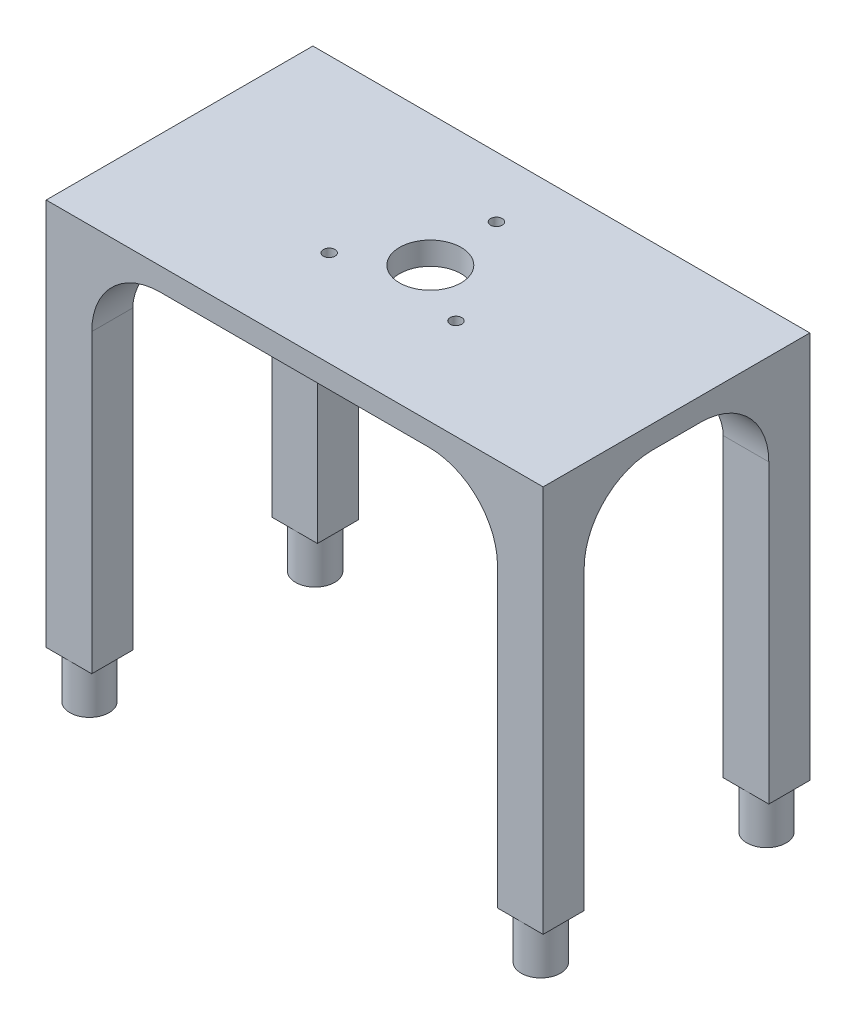
ISO-10303-21;
HEADER;
FILE_DESCRIPTION(('STEP AP214'),'2;1');
FILE_NAME('part.step','',(''),(''),'','','');
FILE_SCHEMA(('AUTOMOTIVE_DESIGN { 1 0 10303 214 1 1 1 1 }'));
ENDSEC;
DATA;
#1=APPLICATION_CONTEXT('core data for automotive mechanical design processes');
#2=APPLICATION_PROTOCOL_DEFINITION('international standard','automotive_design',2000,#1);
#3=PRODUCT_CONTEXT('',#1,'mechanical');
#4=PRODUCT('Part','Part','',(#3));
#5=PRODUCT_RELATED_PRODUCT_CATEGORY('part','',(#4));
#6=PRODUCT_DEFINITION_FORMATION('','',#4);
#7=PRODUCT_DEFINITION_CONTEXT('part definition',#1,'design');
#8=PRODUCT_DEFINITION('design','',#6,#7);
#9=PRODUCT_DEFINITION_SHAPE('','',#8);
#10=(LENGTH_UNIT() NAMED_UNIT(*) SI_UNIT(.MILLI.,.METRE.));
#11=(NAMED_UNIT(*) PLANE_ANGLE_UNIT() SI_UNIT($,.RADIAN.));
#12=(NAMED_UNIT(*) SI_UNIT($,.STERADIAN.) SOLID_ANGLE_UNIT());
#13=UNCERTAINTY_MEASURE_WITH_UNIT(LENGTH_MEASURE(1.E-05),#10,'distance_accuracy_value','');
#14=(GEOMETRIC_REPRESENTATION_CONTEXT(3) GLOBAL_UNCERTAINTY_ASSIGNED_CONTEXT((#13)) GLOBAL_UNIT_ASSIGNED_CONTEXT((#10,
#11,#12)) REPRESENTATION_CONTEXT('',''));
#15=CARTESIAN_POINT('',(0.,0.,0.));
#16=DIRECTION('',(0.,0.,1.));
#17=DIRECTION('',(1.,0.,0.));
#18=AXIS2_PLACEMENT_3D('',#15,#16,#17);
#19=CARTESIAN_POINT('',(0.,90.,0.));
#20=DIRECTION('',(0.,-1.,0.));
#21=DIRECTION('',(0.,0.,-1.));
#22=AXIS2_PLACEMENT_3D('',#19,#20,#21);
#23=PLANE('',#22);
#24=CARTESIAN_POINT('',(-0.965131435348161,90.,-40.7219628095155));
#25=DIRECTION('',(0.,1.,0.));
#26=DIRECTION('',(0.,0.,1.));
#27=AXIS2_PLACEMENT_3D('',#24,#25,#26);
#28=CIRCLE('',#27,1.275);
#29=CARTESIAN_POINT('',(-0.965131435348161,90.,-39.4469628095155));
#30=VERTEX_POINT('',#29);
#31=EDGE_CURVE('E461',#30,#30,#28,.T.);
#32=ORIENTED_EDGE('',*,*,#31,.T.);
#33=EDGE_LOOP('',(#32));
#34=FACE_BOUND('',#33,.T.);
#35=CARTESIAN_POINT('',(0.00302612595053098,90.,-25.2522287802408));
#36=DIRECTION('',(0.,1.,0.));
#37=DIRECTION('',(0.,0.,1.));
#38=AXIS2_PLACEMENT_3D('',#35,#36,#37);
#39=CIRCLE('',#38,6.75);
#40=CARTESIAN_POINT('',(0.00302612595053098,90.,-18.5022287802408));
#41=VERTEX_POINT('',#40);
#42=EDGE_CURVE('E482',#41,#41,#39,.T.);
#43=ORIENTED_EDGE('',*,*,#42,.T.);
#44=EDGE_LOOP('',(#43));
#45=FACE_BOUND('',#44,.T.);
#46=CARTESIAN_POINT('',(-13.4203676327494,90.,-16.5022287802408));
#47=DIRECTION('',(0.,1.,0.));
#48=DIRECTION('',(0.,0.,1.));
#49=AXIS2_PLACEMENT_3D('',#46,#47,#48);
#50=CIRCLE('',#49,1.275);
#51=CARTESIAN_POINT('',(-13.4203676327494,90.,-15.2272287802408));
#52=VERTEX_POINT('',#51);
#53=EDGE_CURVE('E481',#52,#52,#50,.T.);
#54=ORIENTED_EDGE('',*,*,#53,.T.);
#55=EDGE_LOOP('',(#54));
#56=FACE_BOUND('',#55,.T.);
#57=CARTESIAN_POINT('',(13.4089002647704,90.,-17.4719628095155));
#58=DIRECTION('',(0.,1.,0.));
#59=DIRECTION('',(0.,0.,1.));
#60=AXIS2_PLACEMENT_3D('',#57,#58,#59);
#61=CIRCLE('',#60,1.275);
#62=CARTESIAN_POINT('',(13.4089002647704,90.,-16.1969628095156));
#63=VERTEX_POINT('',#62);
#64=EDGE_CURVE('E489',#63,#63,#61,.T.);
#65=ORIENTED_EDGE('',*,*,#64,.T.);
#66=EDGE_LOOP('',(#65));
#67=FACE_BOUND('',#66,.T.);
#68=DIRECTION('',(1.,0.,0.));
#69=VECTOR('',#68,1.);
#70=CARTESIAN_POINT('',(0.,90.,-30.));
#71=LINE('',#70,#69);
#72=CARTESIAN_POINT('',(-54.5,90.,-30.));
#73=VERTEX_POINT('',#72);
#74=CARTESIAN_POINT('',(-29.5,90.,-30.));
#75=VERTEX_POINT('',#74);
#76=EDGE_CURVE('E397',#73,#75,#71,.T.);
#77=ORIENTED_EDGE('',*,*,#76,.T.);
#78=DIRECTION('',(0.,0.,-1.));
#79=VECTOR('',#78,1.);
#80=CARTESIAN_POINT('',(-29.5,90.,0.));
#81=LINE('',#80,#79);
#82=CARTESIAN_POINT('',(-29.5,90.,-54.));
#83=VERTEX_POINT('',#82);
#84=EDGE_CURVE('E400',#75,#83,#81,.T.);
#85=ORIENTED_EDGE('',*,*,#84,.T.);
#86=DIRECTION('',(-1.,0.,0.));
#87=VECTOR('',#86,1.);
#88=CARTESIAN_POINT('',(-54.5,90.,-54.));
#89=LINE('',#88,#87);
#90=CARTESIAN_POINT('',(29.5,90.,-54.));
#91=VERTEX_POINT('',#90);
#92=EDGE_CURVE('E308',#91,#83,#89,.T.);
#93=ORIENTED_EDGE('',*,*,#92,.F.);
#94=DIRECTION('',(0.,0.,1.));
#95=VECTOR('',#94,1.);
#96=CARTESIAN_POINT('',(29.5,90.,0.));
#97=LINE('',#96,#95);
#98=CARTESIAN_POINT('',(29.5,90.,-30.));
#99=VERTEX_POINT('',#98);
#100=EDGE_CURVE('E386',#91,#99,#97,.T.);
#101=ORIENTED_EDGE('',*,*,#100,.T.);
#102=DIRECTION('',(1.,0.,0.));
#103=VECTOR('',#102,1.);
#104=CARTESIAN_POINT('',(0.,90.,-30.));
#105=LINE('',#104,#103);
#106=CARTESIAN_POINT('',(54.5,90.,-30.));
#107=VERTEX_POINT('',#106);
#108=EDGE_CURVE('E383',#99,#107,#105,.T.);
#109=ORIENTED_EDGE('',*,*,#108,.T.);
#110=DIRECTION('',(0.,0.,-1.));
#111=VECTOR('',#110,1.);
#112=CARTESIAN_POINT('',(54.5,90.,4.5));
#113=LINE('',#112,#111);
#114=CARTESIAN_POINT('',(54.5,90.,-19.5));
#115=VERTEX_POINT('',#114);
#116=EDGE_CURVE('E325',#115,#107,#113,.T.);
#117=ORIENTED_EDGE('',*,*,#116,.F.);
#118=DIRECTION('',(-1.,0.,0.));
#119=VECTOR('',#118,1.);
#120=CARTESIAN_POINT('',(0.,90.,-19.5));
#121=LINE('',#120,#119);
#122=CARTESIAN_POINT('',(29.5,90.,-19.5));
#123=VERTEX_POINT('',#122);
#124=EDGE_CURVE('E379',#115,#123,#121,.T.);
#125=ORIENTED_EDGE('',*,*,#124,.T.);
#126=DIRECTION('',(0.,0.,1.));
#127=VECTOR('',#126,1.);
#128=CARTESIAN_POINT('',(29.5,90.,0.));
#129=LINE('',#128,#127);
#130=CARTESIAN_POINT('',(29.5,90.,4.5));
#131=VERTEX_POINT('',#130);
#132=EDGE_CURVE('E373',#123,#131,#129,.T.);
#133=ORIENTED_EDGE('',*,*,#132,.T.);
#134=DIRECTION('',(1.,0.,0.));
#135=VECTOR('',#134,1.);
#136=CARTESIAN_POINT('',(-54.5,90.,4.5));
#137=LINE('',#136,#135);
#138=CARTESIAN_POINT('',(-29.5,90.,4.5));
#139=VERTEX_POINT('',#138);
#140=EDGE_CURVE('E322',#139,#131,#137,.T.);
#141=ORIENTED_EDGE('',*,*,#140,.F.);
#142=DIRECTION('',(0.,0.,-1.));
#143=VECTOR('',#142,1.);
#144=CARTESIAN_POINT('',(-29.5,90.,0.));
#145=LINE('',#144,#143);
#146=CARTESIAN_POINT('',(-29.5,90.,-19.5));
#147=VERTEX_POINT('',#146);
#148=EDGE_CURVE('E393',#139,#147,#145,.T.);
#149=ORIENTED_EDGE('',*,*,#148,.T.);
#150=DIRECTION('',(-1.,0.,0.));
#151=VECTOR('',#150,1.);
#152=CARTESIAN_POINT('',(0.,90.,-19.5));
#153=LINE('',#152,#151);
#154=CARTESIAN_POINT('',(-54.5,90.,-19.5));
#155=VERTEX_POINT('',#154);
#156=EDGE_CURVE('E390',#147,#155,#153,.T.);
#157=ORIENTED_EDGE('',*,*,#156,.T.);
#158=DIRECTION('',(0.,0.,1.));
#159=VECTOR('',#158,1.);
#160=CARTESIAN_POINT('',(-54.5,90.,4.5));
#161=LINE('',#160,#159);
#162=EDGE_CURVE('E299',#73,#155,#161,.T.);
#163=ORIENTED_EDGE('',*,*,#162,.F.);
#164=EDGE_LOOP('',(#77,#85,#93,#101,#109,#117,#125,#133,#141,#149,#157,#163));
#165=FACE_BOUND('',#164,.T.);
#166=ADVANCED_FACE('F43',(#34,#45,#56,#67,#165),#23,.T.);
#167=CARTESIAN_POINT('',(49.5,10.,0.));
#168=DIRECTION('',(0.,-1.,0.));
#169=DIRECTION('',(0.,0.,-1.));
#170=AXIS2_PLACEMENT_3D('',#167,#168,#169);
#171=CYLINDRICAL_SURFACE('',#170,4.3);
#172=CARTESIAN_POINT('',(49.5,10.,0.));
#173=DIRECTION('',(0.,1.,0.));
#174=DIRECTION('',(0.,0.,1.));
#175=AXIS2_PLACEMENT_3D('',#172,#173,#174);
#176=CIRCLE('',#175,4.3);
#177=CARTESIAN_POINT('',(49.5,10.,4.3));
#178=VERTEX_POINT('',#177);
#179=EDGE_CURVE('E369',#178,#178,#176,.T.);
#180=ORIENTED_EDGE('',*,*,#179,.F.);
#181=EDGE_LOOP('',(#180));
#182=FACE_BOUND('',#181,.T.);
#183=CARTESIAN_POINT('',(49.5,0.,0.));
#184=DIRECTION('',(0.,1.,0.));
#185=DIRECTION('',(0.,0.,1.));
#186=AXIS2_PLACEMENT_3D('',#183,#184,#185);
#187=CIRCLE('',#186,4.3);
#188=CARTESIAN_POINT('',(49.5,0.,4.3));
#189=VERTEX_POINT('',#188);
#190=EDGE_CURVE('E368',#189,#189,#187,.T.);
#191=ORIENTED_EDGE('',*,*,#190,.T.);
#192=EDGE_LOOP('',(#191));
#193=FACE_BOUND('',#192,.T.);
#194=ADVANCED_FACE('F581',(#182,#193),#171,.T.);
#195=CARTESIAN_POINT('',(49.5,0.,0.));
#196=DIRECTION('',(0.,1.,0.));
#197=DIRECTION('',(0.,0.,1.));
#198=AXIS2_PLACEMENT_3D('',#195,#196,#197);
#199=PLANE('',#198);
#200=ORIENTED_EDGE('',*,*,#190,.F.);
#201=EDGE_LOOP('',(#200));
#202=FACE_BOUND('',#201,.T.);
#203=ADVANCED_FACE('F586',(#202),#199,.F.);
#204=CARTESIAN_POINT('',(54.5,90.,4.5));
#205=DIRECTION('',(-1.,0.,0.));
#206=DIRECTION('',(0.,0.,1.));
#207=AXIS2_PLACEMENT_3D('',#204,#205,#206);
#208=PLANE('',#207);
#209=DIRECTION('',(0.,0.,-1.));
#210=VECTOR('',#209,1.);
#211=CARTESIAN_POINT('',(54.5,10.,4.5));
#212=LINE('',#211,#210);
#213=CARTESIAN_POINT('',(54.5,10.,4.5));
#214=VERTEX_POINT('',#213);
#215=CARTESIAN_POINT('',(54.5,10.,-4.5));
#216=VERTEX_POINT('',#215);
#217=EDGE_CURVE('E340',#214,#216,#212,.T.);
#218=ORIENTED_EDGE('',*,*,#217,.T.);
#219=DIRECTION('',(0.,-1.,0.));
#220=VECTOR('',#219,1.);
#221=CARTESIAN_POINT('',(54.5,90.,-4.5));
#222=LINE('',#221,#220);
#223=CARTESIAN_POINT('',(54.5,75.,-4.5));
#224=VERTEX_POINT('',#223);
#225=EDGE_CURVE('E365',#224,#216,#222,.T.);
#226=ORIENTED_EDGE('',*,*,#225,.F.);
#227=CARTESIAN_POINT('',(54.5,75.,-19.5));
#228=DIRECTION('',(-1.,0.,0.));
#229=DIRECTION('',(0.,0.,1.));
#230=AXIS2_PLACEMENT_3D('',#227,#228,#229);
#231=CIRCLE('',#230,15.);
#232=EDGE_CURVE('E53',#224,#115,#231,.T.);
#233=ORIENTED_EDGE('',*,*,#232,.T.);
#234=ORIENTED_EDGE('',*,*,#116,.T.);
#235=CARTESIAN_POINT('',(54.5,75.,-30.));
#236=DIRECTION('',(-1.,0.,0.));
#237=DIRECTION('',(0.,0.,1.));
#238=AXIS2_PLACEMENT_3D('',#235,#236,#237);
#239=CIRCLE('',#238,15.);
#240=CARTESIAN_POINT('',(54.5,75.,-45.));
#241=VERTEX_POINT('',#240);
#242=EDGE_CURVE('E441',#107,#241,#239,.T.);
#243=ORIENTED_EDGE('',*,*,#242,.T.);
#244=DIRECTION('',(0.,-1.,0.));
#245=VECTOR('',#244,1.);
#246=CARTESIAN_POINT('',(54.5,90.,-45.));
#247=LINE('',#246,#245);
#248=CARTESIAN_POINT('',(54.5,10.,-45.));
#249=VERTEX_POINT('',#248);
#250=EDGE_CURVE('E242',#241,#249,#247,.T.);
#251=ORIENTED_EDGE('',*,*,#250,.T.);
#252=DIRECTION('',(0.,0.,-1.));
#253=VECTOR('',#252,1.);
#254=CARTESIAN_POINT('',(54.5,10.,-45.));
#255=LINE('',#254,#253);
#256=CARTESIAN_POINT('',(54.5,10.,-54.));
#257=VERTEX_POINT('',#256);
#258=EDGE_CURVE('E257',#249,#257,#255,.T.);
#259=ORIENTED_EDGE('',*,*,#258,.T.);
#260=DIRECTION('',(0.,-1.,0.));
#261=VECTOR('',#260,1.);
#262=CARTESIAN_POINT('',(54.5,95.,-54.));
#263=LINE('',#262,#261);
#264=CARTESIAN_POINT('',(54.5,95.,-54.));
#265=VERTEX_POINT('',#264);
#266=EDGE_CURVE('E334',#265,#257,#263,.T.);
#267=ORIENTED_EDGE('',*,*,#266,.F.);
#268=DIRECTION('',(0.,0.,-1.));
#269=VECTOR('',#268,1.);
#270=CARTESIAN_POINT('',(54.5,95.,4.5));
#271=LINE('',#270,#269);
#272=CARTESIAN_POINT('',(54.5,95.,4.5));
#273=VERTEX_POINT('',#272);
#274=EDGE_CURVE('E312',#273,#265,#271,.T.);
#275=ORIENTED_EDGE('',*,*,#274,.F.);
#276=DIRECTION('',(0.,-1.,0.));
#277=VECTOR('',#276,1.);
#278=CARTESIAN_POINT('',(54.5,90.,4.5));
#279=LINE('',#278,#277);
#280=EDGE_CURVE('E355',#273,#214,#279,.T.);
#281=ORIENTED_EDGE('',*,*,#280,.T.);
#282=EDGE_LOOP('',(#218,#226,#233,#234,#243,#251,#259,#267,#275,#281));
#283=FACE_BOUND('',#282,.T.);
#284=ADVANCED_FACE('F554',(#283),#208,.F.);
#285=CARTESIAN_POINT('',(44.5,90.,-4.5));
#286=DIRECTION('',(0.,0.,1.));
#287=DIRECTION('',(1.,0.,0.));
#288=AXIS2_PLACEMENT_3D('',#285,#286,#287);
#289=PLANE('',#288);
#290=DIRECTION('',(0.,-1.,0.));
#291=VECTOR('',#290,1.);
#292=CARTESIAN_POINT('',(44.5,90.,-4.5));
#293=LINE('',#292,#291);
#294=CARTESIAN_POINT('',(44.5,75.,-4.5));
#295=VERTEX_POINT('',#294);
#296=CARTESIAN_POINT('',(44.5,10.,-4.5));
#297=VERTEX_POINT('',#296);
#298=EDGE_CURVE('E362',#295,#297,#293,.T.);
#299=ORIENTED_EDGE('',*,*,#298,.F.);
#300=DIRECTION('',(-1.,0.,0.));
#301=VECTOR('',#300,1.);
#302=CARTESIAN_POINT('',(44.5,75.,-4.5));
#303=LINE('',#302,#301);
#304=EDGE_CURVE('E67',#295,#224,#303,.F.);
#305=ORIENTED_EDGE('',*,*,#304,.T.);
#306=ORIENTED_EDGE('',*,*,#225,.T.);
#307=DIRECTION('',(-1.,0.,0.));
#308=VECTOR('',#307,1.);
#309=CARTESIAN_POINT('',(44.5,10.,-4.5));
#310=LINE('',#309,#308);
#311=EDGE_CURVE('E344',#216,#297,#310,.T.);
#312=ORIENTED_EDGE('',*,*,#311,.T.);
#313=EDGE_LOOP('',(#299,#305,#306,#312));
#314=FACE_BOUND('',#313,.T.);
#315=ADVANCED_FACE('F606',(#314),#289,.F.);
#316=CARTESIAN_POINT('',(44.5,90.,4.5));
#317=DIRECTION('',(1.,0.,0.));
#318=DIRECTION('',(0.,0.,-1.));
#319=AXIS2_PLACEMENT_3D('',#316,#317,#318);
#320=PLANE('',#319);
#321=DIRECTION('',(0.,-1.,0.));
#322=VECTOR('',#321,1.);
#323=CARTESIAN_POINT('',(44.5,90.,4.5));
#324=LINE('',#323,#322);
#325=CARTESIAN_POINT('',(44.5,75.,4.5));
#326=VERTEX_POINT('',#325);
#327=CARTESIAN_POINT('',(44.5,10.,4.5));
#328=VERTEX_POINT('',#327);
#329=EDGE_CURVE('E359',#326,#328,#324,.T.);
#330=ORIENTED_EDGE('',*,*,#329,.F.);
#331=DIRECTION('',(0.,0.,1.));
#332=VECTOR('',#331,1.);
#333=CARTESIAN_POINT('',(44.5,75.,4.5));
#334=LINE('',#333,#332);
#335=EDGE_CURVE('E423',#326,#295,#334,.F.);
#336=ORIENTED_EDGE('',*,*,#335,.T.);
#337=ORIENTED_EDGE('',*,*,#298,.T.);
#338=DIRECTION('',(0.,0.,1.));
#339=VECTOR('',#338,1.);
#340=CARTESIAN_POINT('',(44.5,10.,4.5));
#341=LINE('',#340,#339);
#342=EDGE_CURVE('E348',#297,#328,#341,.T.);
#343=ORIENTED_EDGE('',*,*,#342,.T.);
#344=EDGE_LOOP('',(#330,#336,#337,#343));
#345=FACE_BOUND('',#344,.T.);
#346=ADVANCED_FACE('F603',(#345),#320,.F.);
#347=CARTESIAN_POINT('',(44.5,90.,4.5));
#348=DIRECTION('',(0.,0.,-1.));
#349=DIRECTION('',(-1.,0.,0.));
#350=AXIS2_PLACEMENT_3D('',#347,#348,#349);
#351=PLANE('',#350);
#352=DIRECTION('',(1.,0.,0.));
#353=VECTOR('',#352,1.);
#354=CARTESIAN_POINT('',(44.5,10.,4.5));
#355=LINE('',#354,#353);
#356=EDGE_CURVE('E352',#328,#214,#355,.T.);
#357=ORIENTED_EDGE('',*,*,#356,.T.);
#358=ORIENTED_EDGE('',*,*,#280,.F.);
#359=DIRECTION('',(1.,0.,0.));
#360=VECTOR('',#359,1.);
#361=CARTESIAN_POINT('',(-54.5,95.,4.5));
#362=LINE('',#361,#360);
#363=CARTESIAN_POINT('',(-54.5,95.,4.5));
#364=VERTEX_POINT('',#363);
#365=EDGE_CURVE('E307',#364,#273,#362,.T.);
#366=ORIENTED_EDGE('',*,*,#365,.F.);
#367=DIRECTION('',(0.,-1.,0.));
#368=VECTOR('',#367,1.);
#369=CARTESIAN_POINT('',(-54.5,95.,4.5));
#370=LINE('',#369,#368);
#371=CARTESIAN_POINT('',(-54.5,10.,4.5));
#372=VERTEX_POINT('',#371);
#373=EDGE_CURVE('E337',#364,#372,#370,.T.);
#374=ORIENTED_EDGE('',*,*,#373,.T.);
#375=DIRECTION('',(1.,0.,0.));
#376=VECTOR('',#375,1.);
#377=CARTESIAN_POINT('',(-44.5,10.,4.5));
#378=LINE('',#377,#376);
#379=CARTESIAN_POINT('',(-44.5,10.,4.5));
#380=VERTEX_POINT('',#379);
#381=EDGE_CURVE('E278',#372,#380,#378,.T.);
#382=ORIENTED_EDGE('',*,*,#381,.T.);
#383=DIRECTION('',(0.,-1.,0.));
#384=VECTOR('',#383,1.);
#385=CARTESIAN_POINT('',(-44.5,90.,4.5));
#386=LINE('',#385,#384);
#387=CARTESIAN_POINT('',(-44.5,75.,4.5));
#388=VERTEX_POINT('',#387);
#389=EDGE_CURVE('E275',#388,#380,#386,.T.);
#390=ORIENTED_EDGE('',*,*,#389,.F.);
#391=CARTESIAN_POINT('',(-29.5,75.,4.5));
#392=DIRECTION('',(0.,0.,-1.));
#393=DIRECTION('',(-1.,0.,0.));
#394=AXIS2_PLACEMENT_3D('',#391,#392,#393);
#395=CIRCLE('',#394,15.);
#396=EDGE_CURVE('E432',#388,#139,#395,.T.);
#397=ORIENTED_EDGE('',*,*,#396,.T.);
#398=ORIENTED_EDGE('',*,*,#140,.T.);
#399=CARTESIAN_POINT('',(29.5,75.,4.5));
#400=DIRECTION('',(0.,0.,-1.));
#401=DIRECTION('',(-1.,0.,0.));
#402=AXIS2_PLACEMENT_3D('',#399,#400,#401);
#403=CIRCLE('',#402,15.);
#404=EDGE_CURVE('E11',#131,#326,#403,.T.);
#405=ORIENTED_EDGE('',*,*,#404,.T.);
#406=ORIENTED_EDGE('',*,*,#329,.T.);
#407=EDGE_LOOP('',(#357,#358,#366,#374,#382,#390,#397,#398,#405,#406));
#408=FACE_BOUND('',#407,.T.);
#409=ADVANCED_FACE('F540',(#408),#351,.F.);
#410=CARTESIAN_POINT('',(0.,10.,0.));
#411=DIRECTION('',(0.,-1.,0.));
#412=DIRECTION('',(0.,0.,-1.));
#413=AXIS2_PLACEMENT_3D('',#410,#411,#412);
#414=PLANE('',#413);
#415=ORIENTED_EDGE('',*,*,#179,.T.);
#416=EDGE_LOOP('',(#415));
#417=FACE_BOUND('',#416,.T.);
#418=ORIENTED_EDGE('',*,*,#217,.F.);
#419=ORIENTED_EDGE('',*,*,#356,.F.);
#420=ORIENTED_EDGE('',*,*,#342,.F.);
#421=ORIENTED_EDGE('',*,*,#311,.F.);
#422=EDGE_LOOP('',(#418,#419,#420,#421));
#423=FACE_BOUND('',#422,.T.);
#424=ADVANCED_FACE('F597',(#417,#423),#414,.T.);
#425=CARTESIAN_POINT('',(-54.5,95.,4.5));
#426=DIRECTION('',(1.,0.,0.));
#427=DIRECTION('',(0.,0.,-1.));
#428=AXIS2_PLACEMENT_3D('',#425,#426,#427);
#429=PLANE('',#428);
#430=DIRECTION('',(0.,-1.,0.));
#431=VECTOR('',#430,1.);
#432=CARTESIAN_POINT('',(-54.5,95.,-54.));
#433=LINE('',#432,#431);
#434=CARTESIAN_POINT('',(-54.5,95.,-54.));
#435=VERTEX_POINT('',#434);
#436=CARTESIAN_POINT('',(-54.5,10.,-54.));
#437=VERTEX_POINT('',#436);
#438=EDGE_CURVE('E318',#435,#437,#433,.T.);
#439=ORIENTED_EDGE('',*,*,#438,.T.);
#440=DIRECTION('',(0.,0.,1.));
#441=VECTOR('',#440,1.);
#442=CARTESIAN_POINT('',(-54.5,10.,-45.));
#443=LINE('',#442,#441);
#444=CARTESIAN_POINT('',(-54.5,10.,-45.));
#445=VERTEX_POINT('',#444);
#446=EDGE_CURVE('E216',#437,#445,#443,.T.);
#447=ORIENTED_EDGE('',*,*,#446,.T.);
#448=DIRECTION('',(0.,-1.,0.));
#449=VECTOR('',#448,1.);
#450=CARTESIAN_POINT('',(-54.5,90.,-45.));
#451=LINE('',#450,#449);
#452=CARTESIAN_POINT('',(-54.5,75.,-45.));
#453=VERTEX_POINT('',#452);
#454=EDGE_CURVE('E207',#453,#445,#451,.T.);
#455=ORIENTED_EDGE('',*,*,#454,.F.);
#456=CARTESIAN_POINT('',(-54.5,75.,-30.));
#457=DIRECTION('',(1.,0.,0.));
#458=DIRECTION('',(0.,0.,-1.));
#459=AXIS2_PLACEMENT_3D('',#456,#457,#458);
#460=CIRCLE('',#459,15.);
#461=EDGE_CURVE('E429',#453,#73,#460,.T.);
#462=ORIENTED_EDGE('',*,*,#461,.T.);
#463=ORIENTED_EDGE('',*,*,#162,.T.);
#464=CARTESIAN_POINT('',(-54.5,75.,-19.5));
#465=DIRECTION('',(1.,0.,0.));
#466=DIRECTION('',(0.,0.,-1.));
#467=AXIS2_PLACEMENT_3D('',#464,#465,#466);
#468=CIRCLE('',#467,15.);
#469=CARTESIAN_POINT('',(-54.5,75.,-4.5));
#470=VERTEX_POINT('',#469);
#471=EDGE_CURVE('E435',#155,#470,#468,.T.);
#472=ORIENTED_EDGE('',*,*,#471,.T.);
#473=DIRECTION('',(0.,-1.,0.));
#474=VECTOR('',#473,1.);
#475=CARTESIAN_POINT('',(-54.5,90.,-4.5));
#476=LINE('',#475,#474);
#477=CARTESIAN_POINT('',(-54.5,10.,-4.5));
#478=VERTEX_POINT('',#477);
#479=EDGE_CURVE('E272',#470,#478,#476,.T.);
#480=ORIENTED_EDGE('',*,*,#479,.T.);
#481=DIRECTION('',(0.,0.,1.));
#482=VECTOR('',#481,1.);
#483=CARTESIAN_POINT('',(-54.5,10.,4.5));
#484=LINE('',#483,#482);
#485=EDGE_CURVE('E282',#478,#372,#484,.T.);
#486=ORIENTED_EDGE('',*,*,#485,.T.);
#487=ORIENTED_EDGE('',*,*,#373,.F.);
#488=DIRECTION('',(0.,0.,1.));
#489=VECTOR('',#488,1.);
#490=CARTESIAN_POINT('',(-54.5,95.,4.5));
#491=LINE('',#490,#489);
#492=EDGE_CURVE('E303',#435,#364,#491,.T.);
#493=ORIENTED_EDGE('',*,*,#492,.F.);
#494=EDGE_LOOP('',(#439,#447,#455,#462,#463,#472,#480,#486,#487,#493));
#495=FACE_BOUND('',#494,.T.);
#496=ADVANCED_FACE('F505',(#495),#429,.F.);
#497=CARTESIAN_POINT('',(-54.5,95.,-54.));
#498=DIRECTION('',(0.,0.,1.));
#499=DIRECTION('',(1.,0.,0.));
#500=AXIS2_PLACEMENT_3D('',#497,#498,#499);
#501=PLANE('',#500);
#502=ORIENTED_EDGE('',*,*,#266,.T.);
#503=DIRECTION('',(-1.,0.,0.));
#504=VECTOR('',#503,1.);
#505=CARTESIAN_POINT('',(54.5,10.,-54.));
#506=LINE('',#505,#504);
#507=CARTESIAN_POINT('',(44.5,10.,-54.));
#508=VERTEX_POINT('',#507);
#509=EDGE_CURVE('E253',#257,#508,#506,.T.);
#510=ORIENTED_EDGE('',*,*,#509,.T.);
#511=DIRECTION('',(0.,-1.,0.));
#512=VECTOR('',#511,1.);
#513=CARTESIAN_POINT('',(44.5,90.,-54.));
#514=LINE('',#513,#512);
#515=CARTESIAN_POINT('',(44.5,75.,-54.));
#516=VERTEX_POINT('',#515);
#517=EDGE_CURVE('E235',#516,#508,#514,.T.);
#518=ORIENTED_EDGE('',*,*,#517,.F.);
#519=CARTESIAN_POINT('',(29.5,75.,-54.));
#520=DIRECTION('',(0.,0.,1.));
#521=DIRECTION('',(1.,0.,0.));
#522=AXIS2_PLACEMENT_3D('',#519,#520,#521);
#523=CIRCLE('',#522,15.);
#524=EDGE_CURVE('E438',#516,#91,#523,.T.);
#525=ORIENTED_EDGE('',*,*,#524,.T.);
#526=ORIENTED_EDGE('',*,*,#92,.T.);
#527=CARTESIAN_POINT('',(-29.5,75.,-54.));
#528=DIRECTION('',(0.,0.,1.));
#529=DIRECTION('',(1.,0.,0.));
#530=AXIS2_PLACEMENT_3D('',#527,#528,#529);
#531=CIRCLE('',#530,15.);
#532=CARTESIAN_POINT('',(-44.5,75.,-54.));
#533=VERTEX_POINT('',#532);
#534=EDGE_CURVE('E426',#83,#533,#531,.T.);
#535=ORIENTED_EDGE('',*,*,#534,.T.);
#536=DIRECTION('',(0.,-1.,0.));
#537=VECTOR('',#536,1.);
#538=CARTESIAN_POINT('',(-44.5,90.,-54.));
#539=LINE('',#538,#537);
#540=CARTESIAN_POINT('',(-44.5,10.,-54.));
#541=VERTEX_POINT('',#540);
#542=EDGE_CURVE('E450',#533,#541,#539,.T.);
#543=ORIENTED_EDGE('',*,*,#542,.T.);
#544=DIRECTION('',(-1.,0.,0.));
#545=VECTOR('',#544,1.);
#546=CARTESIAN_POINT('',(-54.5,10.,-54.));
#547=LINE('',#546,#545);
#548=EDGE_CURVE('E221',#541,#437,#547,.T.);
#549=ORIENTED_EDGE('',*,*,#548,.T.);
#550=ORIENTED_EDGE('',*,*,#438,.F.);
#551=DIRECTION('',(-1.,0.,0.));
#552=VECTOR('',#551,1.);
#553=CARTESIAN_POINT('',(-54.5,95.,-54.));
#554=LINE('',#553,#552);
#555=EDGE_CURVE('E315',#265,#435,#554,.T.);
#556=ORIENTED_EDGE('',*,*,#555,.F.);
#557=EDGE_LOOP('',(#502,#510,#518,#525,#526,#535,#543,#549,#550,#556));
#558=FACE_BOUND('',#557,.T.);
#559=ADVANCED_FACE('F512',(#558),#501,.F.);
#560=CARTESIAN_POINT('',(0.,95.,0.));
#561=DIRECTION('',(0.,-1.,0.));
#562=DIRECTION('',(0.,0.,-1.));
#563=AXIS2_PLACEMENT_3D('',#560,#561,#562);
#564=PLANE('',#563);
#565=CARTESIAN_POINT('',(-0.965131435348161,95.,-40.7219628095155));
#566=DIRECTION('',(0.,1.,0.));
#567=DIRECTION('',(0.,0.,1.));
#568=AXIS2_PLACEMENT_3D('',#565,#566,#567);
#569=CIRCLE('',#568,1.275);
#570=CARTESIAN_POINT('',(-0.965131435348161,95.,-39.4469628095155));
#571=VERTEX_POINT('',#570);
#572=EDGE_CURVE('E468',#571,#571,#569,.T.);
#573=ORIENTED_EDGE('',*,*,#572,.F.);
#574=EDGE_LOOP('',(#573));
#575=FACE_BOUND('',#574,.T.);
#576=CARTESIAN_POINT('',(0.00302612595053098,95.,-25.2522287802408));
#577=DIRECTION('',(0.,1.,0.));
#578=DIRECTION('',(0.,0.,1.));
#579=AXIS2_PLACEMENT_3D('',#576,#577,#578);
#580=CIRCLE('',#579,6.75);
#581=CARTESIAN_POINT('',(0.00302612595053098,95.,-18.5022287802408));
#582=VERTEX_POINT('',#581);
#583=EDGE_CURVE('E477',#582,#582,#580,.T.);
#584=ORIENTED_EDGE('',*,*,#583,.F.);
#585=EDGE_LOOP('',(#584));
#586=FACE_BOUND('',#585,.T.);
#587=CARTESIAN_POINT('',(-13.4203676327494,95.,-16.5022287802408));
#588=DIRECTION('',(0.,1.,0.));
#589=DIRECTION('',(0.,0.,1.));
#590=AXIS2_PLACEMENT_3D('',#587,#588,#589);
#591=CIRCLE('',#590,1.275);
#592=CARTESIAN_POINT('',(-13.4203676327494,95.,-15.2272287802408));
#593=VERTEX_POINT('',#592);
#594=EDGE_CURVE('E493',#593,#593,#591,.T.);
#595=ORIENTED_EDGE('',*,*,#594,.F.);
#596=EDGE_LOOP('',(#595));
#597=FACE_BOUND('',#596,.T.);
#598=CARTESIAN_POINT('',(13.4089002647704,95.,-17.4719628095155));
#599=DIRECTION('',(0.,1.,0.));
#600=DIRECTION('',(0.,0.,1.));
#601=AXIS2_PLACEMENT_3D('',#598,#599,#600);
#602=CIRCLE('',#601,1.275);
#603=CARTESIAN_POINT('',(13.4089002647704,95.,-16.1969628095156));
#604=VERTEX_POINT('',#603);
#605=EDGE_CURVE('E474',#604,#604,#602,.T.);
#606=ORIENTED_EDGE('',*,*,#605,.F.);
#607=EDGE_LOOP('',(#606));
#608=FACE_BOUND('',#607,.T.);
#609=ORIENTED_EDGE('',*,*,#492,.T.);
#610=ORIENTED_EDGE('',*,*,#365,.T.);
#611=ORIENTED_EDGE('',*,*,#274,.T.);
#612=ORIENTED_EDGE('',*,*,#555,.T.);
#613=EDGE_LOOP('',(#609,#610,#611,#612));
#614=FACE_BOUND('',#613,.T.);
#615=ADVANCED_FACE('F544',(#575,#586,#597,#608,#614),#564,.F.);
#616=CARTESIAN_POINT('',(-49.5,10.,0.));
#617=DIRECTION('',(0.,-1.,0.));
#618=DIRECTION('',(0.,0.,-1.));
#619=AXIS2_PLACEMENT_3D('',#616,#617,#618);
#620=CYLINDRICAL_SURFACE('',#619,4.3);
#621=CARTESIAN_POINT('',(-49.5,10.,0.));
#622=DIRECTION('',(0.,1.,0.));
#623=DIRECTION('',(0.,0.,-1.));
#624=AXIS2_PLACEMENT_3D('',#621,#622,#623);
#625=CIRCLE('',#624,4.3);
#626=CARTESIAN_POINT('',(-49.5,10.,-4.3));
#627=VERTEX_POINT('',#626);
#628=EDGE_CURVE('E294',#627,#627,#625,.T.);
#629=ORIENTED_EDGE('',*,*,#628,.F.);
#630=EDGE_LOOP('',(#629));
#631=FACE_BOUND('',#630,.T.);
#632=CARTESIAN_POINT('',(-49.5,0.,0.));
#633=DIRECTION('',(0.,1.,0.));
#634=DIRECTION('',(0.,0.,-1.));
#635=AXIS2_PLACEMENT_3D('',#632,#633,#634);
#636=CIRCLE('',#635,4.3);
#637=CARTESIAN_POINT('',(-49.5,0.,-4.3));
#638=VERTEX_POINT('',#637);
#639=EDGE_CURVE('E295',#638,#638,#636,.T.);
#640=ORIENTED_EDGE('',*,*,#639,.T.);
#641=EDGE_LOOP('',(#640));
#642=FACE_BOUND('',#641,.T.);
#643=ADVANCED_FACE('F678',(#631,#642),#620,.T.);
#644=CARTESIAN_POINT('',(-49.5,0.,0.));
#645=DIRECTION('',(0.,-1.,0.));
#646=DIRECTION('',(0.,0.,-1.));
#647=AXIS2_PLACEMENT_3D('',#644,#645,#646);
#648=PLANE('',#647);
#649=ORIENTED_EDGE('',*,*,#639,.F.);
#650=EDGE_LOOP('',(#649));
#651=FACE_BOUND('',#650,.T.);
#652=ADVANCED_FACE('F893',(#651),#648,.T.);
#653=CARTESIAN_POINT('',(-44.5,90.,4.5));
#654=DIRECTION('',(-1.,0.,0.));
#655=DIRECTION('',(0.,0.,1.));
#656=AXIS2_PLACEMENT_3D('',#653,#654,#655);
#657=PLANE('',#656);
#658=DIRECTION('',(0.,-1.,0.));
#659=VECTOR('',#658,1.);
#660=CARTESIAN_POINT('',(-44.5,90.,-4.5));
#661=LINE('',#660,#659);
#662=CARTESIAN_POINT('',(-44.5,75.,-4.5));
#663=VERTEX_POINT('',#662);
#664=CARTESIAN_POINT('',(-44.5,10.,-4.5));
#665=VERTEX_POINT('',#664);
#666=EDGE_CURVE('E266',#663,#665,#661,.T.);
#667=ORIENTED_EDGE('',*,*,#666,.F.);
#668=DIRECTION('',(0.,0.,-1.));
#669=VECTOR('',#668,1.);
#670=CARTESIAN_POINT('',(-44.5,75.,4.5));
#671=LINE('',#670,#669);
#672=EDGE_CURVE('E409',#663,#388,#671,.F.);
#673=ORIENTED_EDGE('',*,*,#672,.T.);
#674=ORIENTED_EDGE('',*,*,#389,.T.);
#675=DIRECTION('',(0.,0.,-1.));
#676=VECTOR('',#675,1.);
#677=CARTESIAN_POINT('',(-44.5,10.,4.5));
#678=LINE('',#677,#676);
#679=EDGE_CURVE('E290',#380,#665,#678,.T.);
#680=ORIENTED_EDGE('',*,*,#679,.T.);
#681=EDGE_LOOP('',(#667,#673,#674,#680));
#682=FACE_BOUND('',#681,.T.);
#683=ADVANCED_FACE('F883',(#682),#657,.F.);
#684=CARTESIAN_POINT('',(-44.5,90.,-4.5));
#685=DIRECTION('',(0.,0.,1.));
#686=DIRECTION('',(1.,0.,0.));
#687=AXIS2_PLACEMENT_3D('',#684,#685,#686);
#688=PLANE('',#687);
#689=ORIENTED_EDGE('',*,*,#479,.F.);
#690=DIRECTION('',(-1.,0.,0.));
#691=VECTOR('',#690,1.);
#692=CARTESIAN_POINT('',(-44.5,75.,-4.5));
#693=LINE('',#692,#691);
#694=EDGE_CURVE('E412',#470,#663,#693,.F.);
#695=ORIENTED_EDGE('',*,*,#694,.T.);
#696=ORIENTED_EDGE('',*,*,#666,.T.);
#697=DIRECTION('',(-1.,0.,0.));
#698=VECTOR('',#697,1.);
#699=CARTESIAN_POINT('',(-44.5,10.,-4.5));
#700=LINE('',#699,#698);
#701=EDGE_CURVE('E286',#665,#478,#700,.T.);
#702=ORIENTED_EDGE('',*,*,#701,.T.);
#703=EDGE_LOOP('',(#689,#695,#696,#702));
#704=FACE_BOUND('',#703,.T.);
#705=ADVANCED_FACE('F532',(#704),#688,.F.);
#706=CARTESIAN_POINT('',(0.,10.,0.));
#707=DIRECTION('',(0.,1.,0.));
#708=DIRECTION('',(0.,0.,1.));
#709=AXIS2_PLACEMENT_3D('',#706,#707,#708);
#710=PLANE('',#709);
#711=ORIENTED_EDGE('',*,*,#628,.T.);
#712=EDGE_LOOP('',(#711));
#713=FACE_BOUND('',#712,.T.);
#714=ORIENTED_EDGE('',*,*,#679,.F.);
#715=ORIENTED_EDGE('',*,*,#381,.F.);
#716=ORIENTED_EDGE('',*,*,#485,.F.);
#717=ORIENTED_EDGE('',*,*,#701,.F.);
#718=EDGE_LOOP('',(#714,#715,#716,#717));
#719=FACE_BOUND('',#718,.T.);
#720=ADVANCED_FACE('F539',(#713,#719),#710,.F.);
#721=CARTESIAN_POINT('',(49.5,10.,-49.5));
#722=DIRECTION('',(0.,-1.,0.));
#723=DIRECTION('',(0.,0.,-1.));
#724=AXIS2_PLACEMENT_3D('',#721,#722,#723);
#725=CYLINDRICAL_SURFACE('',#724,4.3);
#726=CARTESIAN_POINT('',(49.5,10.,-49.5));
#727=DIRECTION('',(0.,1.,0.));
#728=DIRECTION('',(0.,0.,1.));
#729=AXIS2_PLACEMENT_3D('',#726,#727,#728);
#730=CIRCLE('',#729,4.3);
#731=CARTESIAN_POINT('',(49.5,10.,-45.2));
#732=VERTEX_POINT('',#731);
#733=EDGE_CURVE('E261',#732,#732,#730,.T.);
#734=ORIENTED_EDGE('',*,*,#733,.F.);
#735=EDGE_LOOP('',(#734));
#736=FACE_BOUND('',#735,.T.);
#737=CARTESIAN_POINT('',(49.5,0.,-49.5));
#738=DIRECTION('',(0.,1.,0.));
#739=DIRECTION('',(0.,0.,1.));
#740=AXIS2_PLACEMENT_3D('',#737,#738,#739);
#741=CIRCLE('',#740,4.3);
#742=CARTESIAN_POINT('',(49.5,0.,-45.2));
#743=VERTEX_POINT('',#742);
#744=EDGE_CURVE('E262',#743,#743,#741,.T.);
#745=ORIENTED_EDGE('',*,*,#744,.T.);
#746=EDGE_LOOP('',(#745));
#747=FACE_BOUND('',#746,.T.);
#748=ADVANCED_FACE('F846',(#736,#747),#725,.T.);
#749=CARTESIAN_POINT('',(49.5,0.,-49.5));
#750=DIRECTION('',(0.,1.,0.));
#751=DIRECTION('',(0.,0.,1.));
#752=AXIS2_PLACEMENT_3D('',#749,#750,#751);
#753=PLANE('',#752);
#754=ORIENTED_EDGE('',*,*,#744,.F.);
#755=EDGE_LOOP('',(#754));
#756=FACE_BOUND('',#755,.T.);
#757=ADVANCED_FACE('F836',(#756),#753,.F.);
#758=CARTESIAN_POINT('',(44.5,90.,-45.));
#759=DIRECTION('',(1.,0.,0.));
#760=DIRECTION('',(0.,0.,-1.));
#761=AXIS2_PLACEMENT_3D('',#758,#759,#760);
#762=PLANE('',#761);
#763=DIRECTION('',(0.,-1.,0.));
#764=VECTOR('',#763,1.);
#765=CARTESIAN_POINT('',(44.5,90.,-45.));
#766=LINE('',#765,#764);
#767=CARTESIAN_POINT('',(44.5,75.,-45.));
#768=VERTEX_POINT('',#767);
#769=CARTESIAN_POINT('',(44.5,10.,-45.));
#770=VERTEX_POINT('',#769);
#771=EDGE_CURVE('E239',#768,#770,#766,.T.);
#772=ORIENTED_EDGE('',*,*,#771,.F.);
#773=DIRECTION('',(0.,0.,1.));
#774=VECTOR('',#773,1.);
#775=CARTESIAN_POINT('',(44.5,75.,-45.));
#776=LINE('',#775,#774);
#777=EDGE_CURVE('E415',#768,#516,#776,.F.);
#778=ORIENTED_EDGE('',*,*,#777,.T.);
#779=ORIENTED_EDGE('',*,*,#517,.T.);
#780=DIRECTION('',(0.,0.,1.));
#781=VECTOR('',#780,1.);
#782=CARTESIAN_POINT('',(44.5,10.,-45.));
#783=LINE('',#782,#781);
#784=EDGE_CURVE('E249',#508,#770,#783,.T.);
#785=ORIENTED_EDGE('',*,*,#784,.T.);
#786=EDGE_LOOP('',(#772,#778,#779,#785));
#787=FACE_BOUND('',#786,.T.);
#788=ADVANCED_FACE('F562',(#787),#762,.F.);
#789=CARTESIAN_POINT('',(54.5,90.,-45.));
#790=DIRECTION('',(0.,0.,-1.));
#791=DIRECTION('',(-1.,0.,0.));
#792=AXIS2_PLACEMENT_3D('',#789,#790,#791);
#793=PLANE('',#792);
#794=ORIENTED_EDGE('',*,*,#250,.F.);
#795=DIRECTION('',(1.,0.,0.));
#796=VECTOR('',#795,1.);
#797=CARTESIAN_POINT('',(54.5,75.,-45.));
#798=LINE('',#797,#796);
#799=EDGE_CURVE('E418',#241,#768,#798,.F.);
#800=ORIENTED_EDGE('',*,*,#799,.T.);
#801=ORIENTED_EDGE('',*,*,#771,.T.);
#802=DIRECTION('',(1.,0.,0.));
#803=VECTOR('',#802,1.);
#804=CARTESIAN_POINT('',(54.5,10.,-45.));
#805=LINE('',#804,#803);
#806=EDGE_CURVE('E245',#770,#249,#805,.T.);
#807=ORIENTED_EDGE('',*,*,#806,.T.);
#808=EDGE_LOOP('',(#794,#800,#801,#807));
#809=FACE_BOUND('',#808,.T.);
#810=ADVANCED_FACE('F559',(#809),#793,.F.);
#811=CARTESIAN_POINT('',(0.,10.,0.));
#812=DIRECTION('',(0.,1.,0.));
#813=DIRECTION('',(0.,0.,1.));
#814=AXIS2_PLACEMENT_3D('',#811,#812,#813);
#815=PLANE('',#814);
#816=ORIENTED_EDGE('',*,*,#733,.T.);
#817=EDGE_LOOP('',(#816));
#818=FACE_BOUND('',#817,.T.);
#819=ORIENTED_EDGE('',*,*,#258,.F.);
#820=ORIENTED_EDGE('',*,*,#806,.F.);
#821=ORIENTED_EDGE('',*,*,#784,.F.);
#822=ORIENTED_EDGE('',*,*,#509,.F.);
#823=EDGE_LOOP('',(#819,#820,#821,#822));
#824=FACE_BOUND('',#823,.T.);
#825=ADVANCED_FACE('F552',(#818,#824),#815,.F.);
#826=CARTESIAN_POINT('',(-49.5,10.,-49.5));
#827=DIRECTION('',(0.,-1.,0.));
#828=DIRECTION('',(0.,0.,-1.));
#829=AXIS2_PLACEMENT_3D('',#826,#827,#828);
#830=CYLINDRICAL_SURFACE('',#829,4.3);
#831=CARTESIAN_POINT('',(-49.5,10.,-49.5));
#832=DIRECTION('',(0.,1.,0.));
#833=DIRECTION('',(0.,0.,-1.));
#834=AXIS2_PLACEMENT_3D('',#831,#832,#833);
#835=CIRCLE('',#834,4.3);
#836=CARTESIAN_POINT('',(-49.5,10.,-53.8));
#837=VERTEX_POINT('',#836);
#838=EDGE_CURVE('E223',#837,#837,#835,.T.);
#839=ORIENTED_EDGE('',*,*,#838,.F.);
#840=EDGE_LOOP('',(#839));
#841=FACE_BOUND('',#840,.T.);
#842=CARTESIAN_POINT('',(-49.5,0.,-49.5));
#843=DIRECTION('',(0.,1.,0.));
#844=DIRECTION('',(0.,0.,-1.));
#845=AXIS2_PLACEMENT_3D('',#842,#843,#844);
#846=CIRCLE('',#845,4.3);
#847=CARTESIAN_POINT('',(-49.5,0.,-53.8));
#848=VERTEX_POINT('',#847);
#849=EDGE_CURVE('E228',#848,#848,#846,.T.);
#850=ORIENTED_EDGE('',*,*,#849,.T.);
#851=EDGE_LOOP('',(#850));
#852=FACE_BOUND('',#851,.T.);
#853=ADVANCED_FACE('F790',(#841,#852),#830,.T.);
#854=CARTESIAN_POINT('',(-49.5,0.,-49.5));
#855=DIRECTION('',(0.,-1.,0.));
#856=DIRECTION('',(0.,0.,-1.));
#857=AXIS2_PLACEMENT_3D('',#854,#855,#856);
#858=PLANE('',#857);
#859=ORIENTED_EDGE('',*,*,#849,.F.);
#860=EDGE_LOOP('',(#859));
#861=FACE_BOUND('',#860,.T.);
#862=ADVANCED_FACE('F780',(#861),#858,.T.);
#863=CARTESIAN_POINT('',(-44.5,90.,-45.));
#864=DIRECTION('',(-1.,0.,0.));
#865=DIRECTION('',(0.,0.,1.));
#866=AXIS2_PLACEMENT_3D('',#863,#864,#865);
#867=PLANE('',#866);
#868=ORIENTED_EDGE('',*,*,#542,.F.);
#869=DIRECTION('',(0.,0.,-1.));
#870=VECTOR('',#869,1.);
#871=CARTESIAN_POINT('',(-44.5,75.,-45.));
#872=LINE('',#871,#870);
#873=CARTESIAN_POINT('',(-44.5,75.,-45.));
#874=VERTEX_POINT('',#873);
#875=EDGE_CURVE('E202',#533,#874,#872,.F.);
#876=ORIENTED_EDGE('',*,*,#875,.T.);
#877=DIRECTION('',(0.,-1.,0.));
#878=VECTOR('',#877,1.);
#879=CARTESIAN_POINT('',(-44.5,90.,-45.));
#880=LINE('',#879,#878);
#881=CARTESIAN_POINT('',(-44.5,10.,-45.));
#882=VERTEX_POINT('',#881);
#883=EDGE_CURVE('E195',#874,#882,#880,.T.);
#884=ORIENTED_EDGE('',*,*,#883,.T.);
#885=DIRECTION('',(0.,0.,-1.));
#886=VECTOR('',#885,1.);
#887=CARTESIAN_POINT('',(-44.5,10.,-45.));
#888=LINE('',#887,#886);
#889=EDGE_CURVE('E200',#882,#541,#888,.T.);
#890=ORIENTED_EDGE('',*,*,#889,.T.);
#891=EDGE_LOOP('',(#868,#876,#884,#890));
#892=FACE_BOUND('',#891,.T.);
#893=ADVANCED_FACE('F198',(#892),#867,.F.);
#894=CARTESIAN_POINT('',(-54.5,90.,-45.));
#895=DIRECTION('',(0.,0.,-1.));
#896=DIRECTION('',(-1.,0.,0.));
#897=AXIS2_PLACEMENT_3D('',#894,#895,#896);
#898=PLANE('',#897);
#899=ORIENTED_EDGE('',*,*,#883,.F.);
#900=DIRECTION('',(1.,0.,0.));
#901=VECTOR('',#900,1.);
#902=CARTESIAN_POINT('',(-54.5,75.,-45.));
#903=LINE('',#902,#901);
#904=EDGE_CURVE('E406',#874,#453,#903,.F.);
#905=ORIENTED_EDGE('',*,*,#904,.T.);
#906=ORIENTED_EDGE('',*,*,#454,.T.);
#907=DIRECTION('',(1.,0.,0.));
#908=VECTOR('',#907,1.);
#909=CARTESIAN_POINT('',(-54.5,10.,-45.));
#910=LINE('',#909,#908);
#911=EDGE_CURVE('E206',#445,#882,#910,.T.);
#912=ORIENTED_EDGE('',*,*,#911,.T.);
#913=EDGE_LOOP('',(#899,#905,#906,#912));
#914=FACE_BOUND('',#913,.T.);
#915=ADVANCED_FACE('F210',(#914),#898,.F.);
#916=CARTESIAN_POINT('',(0.,10.,0.));
#917=DIRECTION('',(0.,-1.,0.));
#918=DIRECTION('',(0.,0.,-1.));
#919=AXIS2_PLACEMENT_3D('',#916,#917,#918);
#920=PLANE('',#919);
#921=ORIENTED_EDGE('',*,*,#838,.T.);
#922=EDGE_LOOP('',(#921));
#923=FACE_BOUND('',#922,.T.);
#924=ORIENTED_EDGE('',*,*,#889,.F.);
#925=ORIENTED_EDGE('',*,*,#911,.F.);
#926=ORIENTED_EDGE('',*,*,#446,.F.);
#927=ORIENTED_EDGE('',*,*,#548,.F.);
#928=EDGE_LOOP('',(#924,#925,#926,#927));
#929=FACE_BOUND('',#928,.T.);
#930=ADVANCED_FACE('F219',(#923,#929),#920,.T.);
#931=CARTESIAN_POINT('',(0.,75.,-30.));
#932=DIRECTION('',(1.,0.,0.));
#933=DIRECTION('',(0.,0.,-1.));
#934=AXIS2_PLACEMENT_3D('',#931,#932,#933);
#935=CYLINDRICAL_SURFACE('',#934,15.);
#936=ORIENTED_EDGE('',*,*,#461,.F.);
#937=ORIENTED_EDGE('',*,*,#904,.F.);
#938=CARTESIAN_POINT('',(-29.5,75.,-30.));
#939=DIRECTION('',(0.707106781186547,0.,-0.707106781186547));
#940=DIRECTION('',(0.707106781186547,0.,0.707106781186547));
#941=AXIS2_PLACEMENT_3D('',#938,#939,#940);
#942=ELLIPSE('',#941,21.2132034355964,15.);
#943=EDGE_CURVE('E446',#75,#874,#942,.F.);
#944=ORIENTED_EDGE('',*,*,#943,.F.);
#945=ORIENTED_EDGE('',*,*,#76,.F.);
#946=EDGE_LOOP('',(#936,#937,#944,#945));
#947=FACE_BOUND('',#946,.T.);
#948=ADVANCED_FACE('F519',(#947),#935,.F.);
#949=CARTESIAN_POINT('',(-29.5,75.,0.));
#950=DIRECTION('',(0.,0.,-1.));
#951=DIRECTION('',(-1.,0.,0.));
#952=AXIS2_PLACEMENT_3D('',#949,#950,#951);
#953=CYLINDRICAL_SURFACE('',#952,15.);
#954=ORIENTED_EDGE('',*,*,#943,.T.);
#955=ORIENTED_EDGE('',*,*,#875,.F.);
#956=ORIENTED_EDGE('',*,*,#534,.F.);
#957=ORIENTED_EDGE('',*,*,#84,.F.);
#958=EDGE_LOOP('',(#954,#955,#956,#957));
#959=FACE_BOUND('',#958,.T.);
#960=ADVANCED_FACE('F514',(#959),#953,.F.);
#961=CARTESIAN_POINT('',(0.,75.,-19.5));
#962=DIRECTION('',(-1.,0.,0.));
#963=DIRECTION('',(0.,0.,1.));
#964=AXIS2_PLACEMENT_3D('',#961,#962,#963);
#965=CYLINDRICAL_SURFACE('',#964,15.);
#966=ORIENTED_EDGE('',*,*,#471,.F.);
#967=ORIENTED_EDGE('',*,*,#156,.F.);
#968=CARTESIAN_POINT('',(-29.5,75.,-19.5));
#969=DIRECTION('',(-0.707106781186547,0.,-0.707106781186547));
#970=DIRECTION('',(-0.707106781186547,0.,0.707106781186547));
#971=AXIS2_PLACEMENT_3D('',#968,#969,#970);
#972=ELLIPSE('',#971,21.2132034355964,15.);
#973=EDGE_CURVE('E451',#663,#147,#972,.T.);
#974=ORIENTED_EDGE('',*,*,#973,.F.);
#975=ORIENTED_EDGE('',*,*,#694,.F.);
#976=EDGE_LOOP('',(#966,#967,#974,#975));
#977=FACE_BOUND('',#976,.T.);
#978=ADVANCED_FACE('F528',(#977),#965,.F.);
#979=CARTESIAN_POINT('',(-29.5,75.,0.));
#980=DIRECTION('',(0.,0.,-1.));
#981=DIRECTION('',(-1.,0.,0.));
#982=AXIS2_PLACEMENT_3D('',#979,#980,#981);
#983=CYLINDRICAL_SURFACE('',#982,15.);
#984=ORIENTED_EDGE('',*,*,#396,.F.);
#985=ORIENTED_EDGE('',*,*,#672,.F.);
#986=ORIENTED_EDGE('',*,*,#973,.T.);
#987=ORIENTED_EDGE('',*,*,#148,.F.);
#988=EDGE_LOOP('',(#984,#985,#986,#987));
#989=FACE_BOUND('',#988,.T.);
#990=ADVANCED_FACE('F571',(#989),#983,.F.);
#991=CARTESIAN_POINT('',(0.,75.,-30.));
#992=DIRECTION('',(1.,0.,0.));
#993=DIRECTION('',(0.,0.,-1.));
#994=AXIS2_PLACEMENT_3D('',#991,#992,#993);
#995=CYLINDRICAL_SURFACE('',#994,15.);
#996=ORIENTED_EDGE('',*,*,#242,.F.);
#997=ORIENTED_EDGE('',*,*,#108,.F.);
#998=CARTESIAN_POINT('',(29.5,75.,-30.));
#999=DIRECTION('',(0.707106781186547,0.,0.707106781186547));
#1000=DIRECTION('',(0.707106781186547,0.,-0.707106781186547));
#1001=AXIS2_PLACEMENT_3D('',#998,#999,#1000);
#1002=ELLIPSE('',#1001,21.2132034355964,15.);
#1003=EDGE_CURVE('E453',#768,#99,#1002,.T.);
#1004=ORIENTED_EDGE('',*,*,#1003,.F.);
#1005=ORIENTED_EDGE('',*,*,#799,.F.);
#1006=EDGE_LOOP('',(#996,#997,#1004,#1005));
#1007=FACE_BOUND('',#1006,.T.);
#1008=ADVANCED_FACE('F569',(#1007),#995,.F.);
#1009=CARTESIAN_POINT('',(29.5,75.,0.));
#1010=DIRECTION('',(0.,0.,1.));
#1011=DIRECTION('',(1.,0.,0.));
#1012=AXIS2_PLACEMENT_3D('',#1009,#1010,#1011);
#1013=CYLINDRICAL_SURFACE('',#1012,15.);
#1014=ORIENTED_EDGE('',*,*,#524,.F.);
#1015=ORIENTED_EDGE('',*,*,#777,.F.);
#1016=ORIENTED_EDGE('',*,*,#1003,.T.);
#1017=ORIENTED_EDGE('',*,*,#100,.F.);
#1018=EDGE_LOOP('',(#1014,#1015,#1016,#1017));
#1019=FACE_BOUND('',#1018,.T.);
#1020=ADVANCED_FACE('F565',(#1019),#1013,.F.);
#1021=CARTESIAN_POINT('',(29.5,75.,0.));
#1022=DIRECTION('',(0.,0.,1.));
#1023=DIRECTION('',(1.,0.,0.));
#1024=AXIS2_PLACEMENT_3D('',#1021,#1022,#1023);
#1025=CYLINDRICAL_SURFACE('',#1024,15.);
#1026=ORIENTED_EDGE('',*,*,#404,.F.);
#1027=ORIENTED_EDGE('',*,*,#132,.F.);
#1028=CARTESIAN_POINT('',(29.5,75.,-19.5));
#1029=DIRECTION('',(-0.707106781186547,0.,0.707106781186547));
#1030=DIRECTION('',(0.707106781186547,0.,0.707106781186547));
#1031=AXIS2_PLACEMENT_3D('',#1028,#1029,#1030);
#1032=ELLIPSE('',#1031,21.2132034355964,15.);
#1033=EDGE_CURVE('E47',#295,#123,#1032,.T.);
#1034=ORIENTED_EDGE('',*,*,#1033,.F.);
#1035=ORIENTED_EDGE('',*,*,#335,.F.);
#1036=EDGE_LOOP('',(#1026,#1027,#1034,#1035));
#1037=FACE_BOUND('',#1036,.T.);
#1038=ADVANCED_FACE('F45',(#1037),#1025,.F.);
#1039=CARTESIAN_POINT('',(0.,75.,-19.5));
#1040=DIRECTION('',(-1.,0.,0.));
#1041=DIRECTION('',(0.,0.,1.));
#1042=AXIS2_PLACEMENT_3D('',#1039,#1040,#1041);
#1043=CYLINDRICAL_SURFACE('',#1042,15.);
#1044=ORIENTED_EDGE('',*,*,#232,.F.);
#1045=ORIENTED_EDGE('',*,*,#304,.F.);
#1046=ORIENTED_EDGE('',*,*,#1033,.T.);
#1047=ORIENTED_EDGE('',*,*,#124,.F.);
#1048=EDGE_LOOP('',(#1044,#1045,#1046,#1047));
#1049=FACE_BOUND('',#1048,.T.);
#1050=ADVANCED_FACE('F650',(#1049),#1043,.F.);
#1051=CARTESIAN_POINT('',(13.4089002647704,90.,-17.4719628095155));
#1052=DIRECTION('',(0.,1.,0.));
#1053=DIRECTION('',(0.,0.,1.));
#1054=AXIS2_PLACEMENT_3D('',#1051,#1052,#1053);
#1055=CYLINDRICAL_SURFACE('',#1054,1.275);
#1056=ORIENTED_EDGE('',*,*,#64,.F.);
#1057=EDGE_LOOP('',(#1056));
#1058=FACE_BOUND('',#1057,.T.);
#1059=ORIENTED_EDGE('',*,*,#605,.T.);
#1060=EDGE_LOOP('',(#1059));
#1061=FACE_BOUND('',#1060,.T.);
#1062=ADVANCED_FACE('F659',(#1058,#1061),#1055,.F.);
#1063=CARTESIAN_POINT('',(-13.4203676327494,90.,-16.5022287802408));
#1064=DIRECTION('',(0.,1.,0.));
#1065=DIRECTION('',(0.,0.,1.));
#1066=AXIS2_PLACEMENT_3D('',#1063,#1064,#1065);
#1067=CYLINDRICAL_SURFACE('',#1066,1.275);
#1068=ORIENTED_EDGE('',*,*,#53,.F.);
#1069=EDGE_LOOP('',(#1068));
#1070=FACE_BOUND('',#1069,.T.);
#1071=ORIENTED_EDGE('',*,*,#594,.T.);
#1072=EDGE_LOOP('',(#1071));
#1073=FACE_BOUND('',#1072,.T.);
#1074=ADVANCED_FACE('F689',(#1070,#1073),#1067,.F.);
#1075=CARTESIAN_POINT('',(0.00302612595053098,90.,-25.2522287802408));
#1076=DIRECTION('',(0.,1.,0.));
#1077=DIRECTION('',(0.,0.,1.));
#1078=AXIS2_PLACEMENT_3D('',#1075,#1076,#1077);
#1079=CYLINDRICAL_SURFACE('',#1078,6.75);
#1080=ORIENTED_EDGE('',*,*,#42,.F.);
#1081=EDGE_LOOP('',(#1080));
#1082=FACE_BOUND('',#1081,.T.);
#1083=ORIENTED_EDGE('',*,*,#583,.T.);
#1084=EDGE_LOOP('',(#1083));
#1085=FACE_BOUND('',#1084,.T.);
#1086=ADVANCED_FACE('F700',(#1082,#1085),#1079,.F.);
#1087=CARTESIAN_POINT('',(-0.965131435348161,90.,-40.7219628095155));
#1088=DIRECTION('',(0.,1.,0.));
#1089=DIRECTION('',(0.,0.,1.));
#1090=AXIS2_PLACEMENT_3D('',#1087,#1088,#1089);
#1091=CYLINDRICAL_SURFACE('',#1090,1.275);
#1092=ORIENTED_EDGE('',*,*,#31,.F.);
#1093=EDGE_LOOP('',(#1092));
#1094=FACE_BOUND('',#1093,.T.);
#1095=ORIENTED_EDGE('',*,*,#572,.T.);
#1096=EDGE_LOOP('',(#1095));
#1097=FACE_BOUND('',#1096,.T.);
#1098=ADVANCED_FACE('F711',(#1094,#1097),#1091,.F.);
#1099=CLOSED_SHELL('',(#166,#194,#203,#284,#315,#346,#409,#424,#496,#559,#615,#643,#652,#683,
#705,#720,#748,#757,#788,#810,#825,#853,#862,#893,#915,#930,#948,#960,#978,#990,#1008,#1020,
#1038,#1050,#1062,#1074,#1086,#1098));
#1100=MANIFOLD_SOLID_BREP('B2',#1099);
#1101=ADVANCED_BREP_SHAPE_REPRESENTATION('',(#18,#1100),#14);
#1102=SHAPE_DEFINITION_REPRESENTATION(#9,#1101);
ENDSEC;
END-ISO-10303-21;
